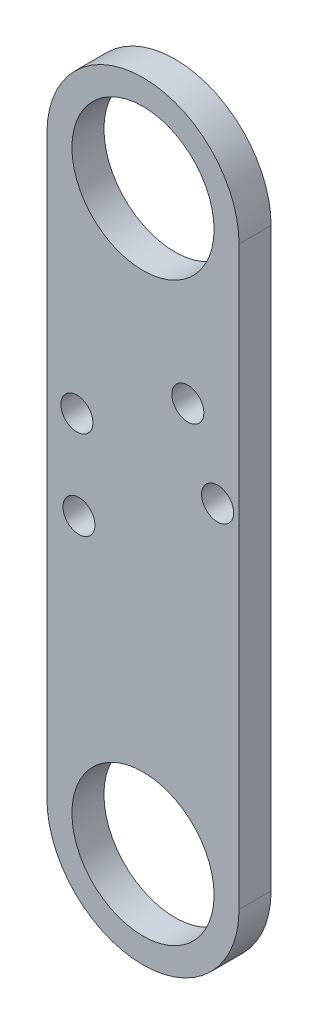
ISO-10303-21;
HEADER;
FILE_DESCRIPTION(('STEP AP214'),'2;1');
FILE_NAME('part.step','',(''),(''),'','','');
FILE_SCHEMA(('AUTOMOTIVE_DESIGN { 1 0 10303 214 1 1 1 1 }'));
ENDSEC;
DATA;
#1=APPLICATION_CONTEXT('core data for automotive mechanical design processes');
#2=APPLICATION_PROTOCOL_DEFINITION('international standard','automotive_design',2000,#1);
#3=PRODUCT_CONTEXT('',#1,'mechanical');
#4=PRODUCT('Part','Part','',(#3));
#5=PRODUCT_RELATED_PRODUCT_CATEGORY('part','',(#4));
#6=PRODUCT_DEFINITION_FORMATION('','',#4);
#7=PRODUCT_DEFINITION_CONTEXT('part definition',#1,'design');
#8=PRODUCT_DEFINITION('design','',#6,#7);
#9=PRODUCT_DEFINITION_SHAPE('','',#8);
#10=(LENGTH_UNIT() NAMED_UNIT(*) SI_UNIT(.MILLI.,.METRE.));
#11=(NAMED_UNIT(*) PLANE_ANGLE_UNIT() SI_UNIT($,.RADIAN.));
#12=(NAMED_UNIT(*) SI_UNIT($,.STERADIAN.) SOLID_ANGLE_UNIT());
#13=UNCERTAINTY_MEASURE_WITH_UNIT(LENGTH_MEASURE(1.E-05),#10,'distance_accuracy_value','');
#14=(GEOMETRIC_REPRESENTATION_CONTEXT(3) GLOBAL_UNCERTAINTY_ASSIGNED_CONTEXT((#13)) GLOBAL_UNIT_ASSIGNED_CONTEXT((#10,
#11,#12)) REPRESENTATION_CONTEXT('',''));
#15=CARTESIAN_POINT('',(0.,0.,0.));
#16=DIRECTION('',(0.,0.,1.));
#17=DIRECTION('',(1.,0.,0.));
#18=AXIS2_PLACEMENT_3D('',#15,#16,#17);
#19=CARTESIAN_POINT('',(0.,0.,72.));
#20=DIRECTION('',(0.,0.,-1.));
#21=DIRECTION('',(-1.,0.,0.));
#22=AXIS2_PLACEMENT_3D('',#19,#20,#21);
#23=CYLINDRICAL_SURFACE('',#22,15.);
#24=CARTESIAN_POINT('',(0.,0.,67.));
#25=DIRECTION('',(0.,0.,-1.));
#26=DIRECTION('',(-1.,0.,0.));
#27=AXIS2_PLACEMENT_3D('',#24,#25,#26);
#28=CIRCLE('',#27,15.);
#29=CARTESIAN_POINT('',(15.,0.,67.));
#30=VERTEX_POINT('',#29);
#31=CARTESIAN_POINT('',(-15.,0.,67.));
#32=VERTEX_POINT('',#31);
#33=EDGE_CURVE('E71',#30,#32,#28,.T.);
#34=ORIENTED_EDGE('',*,*,#33,.F.);
#35=DIRECTION('',(0.,0.,-1.));
#36=VECTOR('',#35,1.);
#37=CARTESIAN_POINT('',(15.,0.,72.));
#38=LINE('',#37,#36);
#39=CARTESIAN_POINT('',(15.,0.,72.));
#40=VERTEX_POINT('',#39);
#41=EDGE_CURVE('E118',#40,#30,#38,.T.);
#42=ORIENTED_EDGE('',*,*,#41,.F.);
#43=CARTESIAN_POINT('',(0.,0.,72.));
#44=DIRECTION('',(0.,0.,1.));
#45=DIRECTION('',(1.,0.,0.));
#46=AXIS2_PLACEMENT_3D('',#43,#44,#45);
#47=CIRCLE('',#46,15.);
#48=CARTESIAN_POINT('',(-15.,0.,72.));
#49=VERTEX_POINT('',#48);
#50=EDGE_CURVE('E148',#49,#40,#47,.T.);
#51=ORIENTED_EDGE('',*,*,#50,.F.);
#52=DIRECTION('',(0.,0.,-1.));
#53=VECTOR('',#52,1.);
#54=CARTESIAN_POINT('',(-15.,0.,72.));
#55=LINE('',#54,#53);
#56=EDGE_CURVE('E125',#49,#32,#55,.T.);
#57=ORIENTED_EDGE('',*,*,#56,.T.);
#58=EDGE_LOOP('',(#34,#42,#51,#57));
#59=FACE_BOUND('',#58,.T.);
#60=ADVANCED_FACE('F62',(#59),#23,.T.);
#61=CARTESIAN_POINT('',(0.,0.,72.));
#62=DIRECTION('',(0.,0.,-1.));
#63=DIRECTION('',(-1.,0.,0.));
#64=AXIS2_PLACEMENT_3D('',#61,#62,#63);
#65=CYLINDRICAL_SURFACE('',#64,11.1);
#66=CARTESIAN_POINT('',(0.,0.,72.));
#67=DIRECTION('',(0.,0.,1.));
#68=DIRECTION('',(1.,0.,0.));
#69=AXIS2_PLACEMENT_3D('',#66,#67,#68);
#70=CIRCLE('',#69,11.1);
#71=CARTESIAN_POINT('',(11.1,0.,72.));
#72=VERTEX_POINT('',#71);
#73=EDGE_CURVE('E132',#72,#72,#70,.T.);
#74=ORIENTED_EDGE('',*,*,#73,.T.);
#75=EDGE_LOOP('',(#74));
#76=FACE_BOUND('',#75,.T.);
#77=CARTESIAN_POINT('',(0.,0.,67.));
#78=DIRECTION('',(0.,0.,-1.));
#79=DIRECTION('',(-1.,0.,0.));
#80=AXIS2_PLACEMENT_3D('',#77,#78,#79);
#81=CIRCLE('',#80,11.1);
#82=CARTESIAN_POINT('',(-11.1,0.,67.));
#83=VERTEX_POINT('',#82);
#84=EDGE_CURVE('E135',#83,#83,#81,.T.);
#85=ORIENTED_EDGE('',*,*,#84,.T.);
#86=EDGE_LOOP('',(#85));
#87=FACE_BOUND('',#86,.T.);
#88=ADVANCED_FACE('F190',(#76,#87),#65,.F.);
#89=CARTESIAN_POINT('',(0.,90.,72.));
#90=DIRECTION('',(0.,0.,-1.));
#91=DIRECTION('',(-1.,0.,0.));
#92=AXIS2_PLACEMENT_3D('',#89,#90,#91);
#93=CYLINDRICAL_SURFACE('',#92,15.);
#94=CARTESIAN_POINT('',(0.,90.,67.));
#95=DIRECTION('',(0.,0.,-1.));
#96=DIRECTION('',(-1.,0.,0.));
#97=AXIS2_PLACEMENT_3D('',#94,#95,#96);
#98=CIRCLE('',#97,15.);
#99=CARTESIAN_POINT('',(-15.,90.,67.));
#100=VERTEX_POINT('',#99);
#101=CARTESIAN_POINT('',(15.,90.,67.));
#102=VERTEX_POINT('',#101);
#103=EDGE_CURVE('E99',#100,#102,#98,.T.);
#104=ORIENTED_EDGE('',*,*,#103,.F.);
#105=DIRECTION('',(0.,0.,-1.));
#106=VECTOR('',#105,1.);
#107=CARTESIAN_POINT('',(-15.,90.,72.));
#108=LINE('',#107,#106);
#109=CARTESIAN_POINT('',(-15.,90.,72.));
#110=VERTEX_POINT('',#109);
#111=EDGE_CURVE('E123',#110,#100,#108,.T.);
#112=ORIENTED_EDGE('',*,*,#111,.F.);
#113=CARTESIAN_POINT('',(0.,90.,72.));
#114=DIRECTION('',(0.,0.,1.));
#115=DIRECTION('',(1.,0.,0.));
#116=AXIS2_PLACEMENT_3D('',#113,#114,#115);
#117=CIRCLE('',#116,15.);
#118=CARTESIAN_POINT('',(15.,90.,72.));
#119=VERTEX_POINT('',#118);
#120=EDGE_CURVE('E122',#119,#110,#117,.T.);
#121=ORIENTED_EDGE('',*,*,#120,.F.);
#122=DIRECTION('',(0.,0.,-1.));
#123=VECTOR('',#122,1.);
#124=CARTESIAN_POINT('',(15.,90.,72.));
#125=LINE('',#124,#123);
#126=EDGE_CURVE('E115',#119,#102,#125,.T.);
#127=ORIENTED_EDGE('',*,*,#126,.T.);
#128=EDGE_LOOP('',(#104,#112,#121,#127));
#129=FACE_BOUND('',#128,.T.);
#130=ADVANCED_FACE('F120',(#129),#93,.T.);
#131=CARTESIAN_POINT('',(0.,90.,72.));
#132=DIRECTION('',(0.,0.,-1.));
#133=DIRECTION('',(-1.,0.,0.));
#134=AXIS2_PLACEMENT_3D('',#131,#132,#133);
#135=CYLINDRICAL_SURFACE('',#134,11.1);
#136=CARTESIAN_POINT('',(0.,90.,72.));
#137=DIRECTION('',(0.,0.,1.));
#138=DIRECTION('',(1.,0.,0.));
#139=AXIS2_PLACEMENT_3D('',#136,#137,#138);
#140=CIRCLE('',#139,11.1);
#141=CARTESIAN_POINT('',(11.1,90.,72.));
#142=VERTEX_POINT('',#141);
#143=EDGE_CURVE('E137',#142,#142,#140,.T.);
#144=ORIENTED_EDGE('',*,*,#143,.T.);
#145=EDGE_LOOP('',(#144));
#146=FACE_BOUND('',#145,.T.);
#147=CARTESIAN_POINT('',(0.,90.,67.));
#148=DIRECTION('',(0.,0.,-1.));
#149=DIRECTION('',(-1.,0.,0.));
#150=AXIS2_PLACEMENT_3D('',#147,#148,#149);
#151=CIRCLE('',#150,11.1);
#152=CARTESIAN_POINT('',(-11.1,90.,67.));
#153=VERTEX_POINT('',#152);
#154=EDGE_CURVE('E142',#153,#153,#151,.T.);
#155=ORIENTED_EDGE('',*,*,#154,.T.);
#156=EDGE_LOOP('',(#155));
#157=FACE_BOUND('',#156,.T.);
#158=ADVANCED_FACE('F64',(#146,#157),#135,.F.);
#159=CARTESIAN_POINT('',(55.,115.,67.));
#160=DIRECTION('',(0.,0.,-1.));
#161=DIRECTION('',(-1.,0.,0.));
#162=AXIS2_PLACEMENT_3D('',#159,#160,#161);
#163=PLANE('',#162);
#164=ORIENTED_EDGE('',*,*,#33,.T.);
#165=DIRECTION('',(0.,-1.,0.));
#166=VECTOR('',#165,1.);
#167=CARTESIAN_POINT('',(-15.,115.,67.));
#168=LINE('',#167,#166);
#169=EDGE_CURVE('E12',#100,#32,#168,.T.);
#170=ORIENTED_EDGE('',*,*,#169,.F.);
#171=ORIENTED_EDGE('',*,*,#103,.T.);
#172=DIRECTION('',(0.,-1.,0.));
#173=VECTOR('',#172,1.);
#174=CARTESIAN_POINT('',(15.,90.,67.));
#175=LINE('',#174,#173);
#176=EDGE_CURVE('E103',#102,#30,#175,.T.);
#177=ORIENTED_EDGE('',*,*,#176,.T.);
#178=EDGE_LOOP('',(#164,#170,#171,#177));
#179=FACE_BOUND('',#178,.T.);
#180=ORIENTED_EDGE('',*,*,#154,.F.);
#181=EDGE_LOOP('',(#180));
#182=FACE_BOUND('',#181,.T.);
#183=CARTESIAN_POINT('',(11.650635094611,53.21224929608,67.));
#184=DIRECTION('',(0.,0.,1.));
#185=DIRECTION('',(1.,0.,0.));
#186=AXIS2_PLACEMENT_3D('',#183,#184,#185);
#187=CIRCLE('',#186,2.5);
#188=CARTESIAN_POINT('',(14.150635094611,53.21224929608,67.));
#189=VERTEX_POINT('',#188);
#190=EDGE_CURVE('E160',#189,#189,#187,.F.);
#191=ORIENTED_EDGE('',*,*,#190,.F.);
#192=EDGE_LOOP('',(#191));
#193=FACE_BOUND('',#192,.T.);
#194=CARTESIAN_POINT('',(-10.,40.71224929608,67.));
#195=DIRECTION('',(0.,0.,1.));
#196=DIRECTION('',(1.,0.,0.));
#197=AXIS2_PLACEMENT_3D('',#194,#195,#196);
#198=CIRCLE('',#197,2.5);
#199=CARTESIAN_POINT('',(-7.50000000000001,40.71224929608,67.));
#200=VERTEX_POINT('',#199);
#201=EDGE_CURVE('E164',#200,#200,#198,.F.);
#202=ORIENTED_EDGE('',*,*,#201,.F.);
#203=EDGE_LOOP('',(#202));
#204=FACE_BOUND('',#203,.T.);
#205=ORIENTED_EDGE('',*,*,#84,.F.);
#206=EDGE_LOOP('',(#205));
#207=FACE_BOUND('',#206,.T.);
#208=CARTESIAN_POINT('',(7.,64.4114817289327,67.));
#209=DIRECTION('',(0.,0.,1.));
#210=DIRECTION('',(1.,0.,0.));
#211=AXIS2_PLACEMENT_3D('',#208,#209,#210);
#212=CIRCLE('',#211,2.5);
#213=CARTESIAN_POINT('',(9.5,64.4114817289327,67.));
#214=VERTEX_POINT('',#213);
#215=EDGE_CURVE('E66',#214,#214,#212,.F.);
#216=ORIENTED_EDGE('',*,*,#215,.F.);
#217=EDGE_LOOP('',(#216));
#218=FACE_BOUND('',#217,.T.);
#219=CARTESIAN_POINT('',(-10.3205080756888,54.4114817289327,67.));
#220=DIRECTION('',(0.,0.,1.));
#221=DIRECTION('',(1.,0.,0.));
#222=AXIS2_PLACEMENT_3D('',#219,#220,#221);
#223=CIRCLE('',#222,2.5);
#224=CARTESIAN_POINT('',(-7.82050807568877,54.4114817289327,67.));
#225=VERTEX_POINT('',#224);
#226=EDGE_CURVE('E167',#225,#225,#223,.F.);
#227=ORIENTED_EDGE('',*,*,#226,.F.);
#228=EDGE_LOOP('',(#227));
#229=FACE_BOUND('',#228,.T.);
#230=ADVANCED_FACE('F101',(#179,#182,#193,#204,#207,#218,#229),#163,.T.);
#231=CARTESIAN_POINT('',(15.,90.,72.));
#232=DIRECTION('',(-1.,0.,0.));
#233=DIRECTION('',(0.,-1.,0.));
#234=AXIS2_PLACEMENT_3D('',#231,#232,#233);
#235=PLANE('',#234);
#236=ORIENTED_EDGE('',*,*,#176,.F.);
#237=ORIENTED_EDGE('',*,*,#126,.F.);
#238=DIRECTION('',(0.,1.,0.));
#239=VECTOR('',#238,1.);
#240=CARTESIAN_POINT('',(15.,90.,72.));
#241=LINE('',#240,#239);
#242=EDGE_CURVE('E108',#40,#119,#241,.T.);
#243=ORIENTED_EDGE('',*,*,#242,.F.);
#244=ORIENTED_EDGE('',*,*,#41,.T.);
#245=EDGE_LOOP('',(#236,#237,#243,#244));
#246=FACE_BOUND('',#245,.T.);
#247=ADVANCED_FACE('F113',(#246),#235,.F.);
#248=CARTESIAN_POINT('',(-15.,90.,72.));
#249=DIRECTION('',(1.,0.,0.));
#250=DIRECTION('',(0.,1.,0.));
#251=AXIS2_PLACEMENT_3D('',#248,#249,#250);
#252=PLANE('',#251);
#253=ORIENTED_EDGE('',*,*,#111,.T.);
#254=ORIENTED_EDGE('',*,*,#169,.T.);
#255=ORIENTED_EDGE('',*,*,#56,.F.);
#256=DIRECTION('',(0.,-1.,0.));
#257=VECTOR('',#256,1.);
#258=CARTESIAN_POINT('',(-15.,90.,72.));
#259=LINE('',#258,#257);
#260=EDGE_CURVE('E146',#110,#49,#259,.T.);
#261=ORIENTED_EDGE('',*,*,#260,.F.);
#262=EDGE_LOOP('',(#253,#254,#255,#261));
#263=FACE_BOUND('',#262,.T.);
#264=ADVANCED_FACE('F184',(#263),#252,.F.);
#265=CARTESIAN_POINT('',(11.650635094611,53.21224929608,72.));
#266=DIRECTION('',(0.,0.,-1.));
#267=DIRECTION('',(0.,1.,0.));
#268=AXIS2_PLACEMENT_3D('',#265,#266,#267);
#269=CYLINDRICAL_SURFACE('',#268,2.5);
#270=ORIENTED_EDGE('',*,*,#190,.T.);
#271=EDGE_LOOP('',(#270));
#272=FACE_BOUND('',#271,.T.);
#273=CARTESIAN_POINT('',(11.650635094611,53.21224929608,72.));
#274=DIRECTION('',(0.,0.,-1.));
#275=DIRECTION('',(0.,1.,0.));
#276=AXIS2_PLACEMENT_3D('',#273,#274,#275);
#277=CIRCLE('',#276,2.5);
#278=CARTESIAN_POINT('',(11.650635094611,55.71224929608,72.));
#279=VERTEX_POINT('',#278);
#280=EDGE_CURVE('E128',#279,#279,#277,.T.);
#281=ORIENTED_EDGE('',*,*,#280,.F.);
#282=EDGE_LOOP('',(#281));
#283=FACE_BOUND('',#282,.T.);
#284=ADVANCED_FACE('F199',(#272,#283),#269,.F.);
#285=CARTESIAN_POINT('',(-10.,40.71224929608,72.));
#286=DIRECTION('',(0.,0.,-1.));
#287=DIRECTION('',(0.,1.,0.));
#288=AXIS2_PLACEMENT_3D('',#285,#286,#287);
#289=CYLINDRICAL_SURFACE('',#288,2.5);
#290=ORIENTED_EDGE('',*,*,#201,.T.);
#291=EDGE_LOOP('',(#290));
#292=FACE_BOUND('',#291,.T.);
#293=CARTESIAN_POINT('',(-10.,40.71224929608,72.));
#294=DIRECTION('',(0.,0.,-1.));
#295=DIRECTION('',(0.,1.,0.));
#296=AXIS2_PLACEMENT_3D('',#293,#294,#295);
#297=CIRCLE('',#296,2.5);
#298=CARTESIAN_POINT('',(-10.,43.2122492960801,72.));
#299=VERTEX_POINT('',#298);
#300=EDGE_CURVE('E153',#299,#299,#297,.T.);
#301=ORIENTED_EDGE('',*,*,#300,.F.);
#302=EDGE_LOOP('',(#301));
#303=FACE_BOUND('',#302,.T.);
#304=ADVANCED_FACE('F253',(#292,#303),#289,.F.);
#305=CARTESIAN_POINT('',(-10.3205080756888,54.4114817289327,72.));
#306=DIRECTION('',(0.,0.,-1.));
#307=DIRECTION('',(0.,1.,0.));
#308=AXIS2_PLACEMENT_3D('',#305,#306,#307);
#309=CYLINDRICAL_SURFACE('',#308,2.5);
#310=ORIENTED_EDGE('',*,*,#226,.T.);
#311=EDGE_LOOP('',(#310));
#312=FACE_BOUND('',#311,.T.);
#313=CARTESIAN_POINT('',(-10.3205080756888,54.4114817289327,72.));
#314=DIRECTION('',(0.,0.,-1.));
#315=DIRECTION('',(0.,1.,0.));
#316=AXIS2_PLACEMENT_3D('',#313,#314,#315);
#317=CIRCLE('',#316,2.5);
#318=CARTESIAN_POINT('',(-10.3205080756888,56.9114817289327,72.));
#319=VERTEX_POINT('',#318);
#320=EDGE_CURVE('E156',#319,#319,#317,.T.);
#321=ORIENTED_EDGE('',*,*,#320,.F.);
#322=EDGE_LOOP('',(#321));
#323=FACE_BOUND('',#322,.T.);
#324=ADVANCED_FACE('F220',(#312,#323),#309,.F.);
#325=CARTESIAN_POINT('',(0.,90.,72.));
#326=DIRECTION('',(0.,0.,1.));
#327=DIRECTION('',(1.,0.,0.));
#328=AXIS2_PLACEMENT_3D('',#325,#326,#327);
#329=PLANE('',#328);
#330=CARTESIAN_POINT('',(7.,64.4114817289327,72.));
#331=DIRECTION('',(0.,0.,-1.));
#332=DIRECTION('',(0.,1.,0.));
#333=AXIS2_PLACEMENT_3D('',#330,#331,#332);
#334=CIRCLE('',#333,2.5);
#335=CARTESIAN_POINT('',(7.,66.9114817289327,72.));
#336=VERTEX_POINT('',#335);
#337=EDGE_CURVE('E124',#336,#336,#334,.T.);
#338=ORIENTED_EDGE('',*,*,#337,.T.);
#339=EDGE_LOOP('',(#338));
#340=FACE_BOUND('',#339,.T.);
#341=ORIENTED_EDGE('',*,*,#320,.T.);
#342=EDGE_LOOP('',(#341));
#343=FACE_BOUND('',#342,.T.);
#344=ORIENTED_EDGE('',*,*,#300,.T.);
#345=EDGE_LOOP('',(#344));
#346=FACE_BOUND('',#345,.T.);
#347=ORIENTED_EDGE('',*,*,#280,.T.);
#348=EDGE_LOOP('',(#347));
#349=FACE_BOUND('',#348,.T.);
#350=ORIENTED_EDGE('',*,*,#73,.F.);
#351=EDGE_LOOP('',(#350));
#352=FACE_BOUND('',#351,.T.);
#353=ORIENTED_EDGE('',*,*,#120,.T.);
#354=ORIENTED_EDGE('',*,*,#260,.T.);
#355=ORIENTED_EDGE('',*,*,#50,.T.);
#356=ORIENTED_EDGE('',*,*,#242,.T.);
#357=EDGE_LOOP('',(#353,#354,#355,#356));
#358=FACE_BOUND('',#357,.T.);
#359=ORIENTED_EDGE('',*,*,#143,.F.);
#360=EDGE_LOOP('',(#359));
#361=FACE_BOUND('',#360,.T.);
#362=ADVANCED_FACE('F217',(#340,#343,#346,#349,#352,#358,#361),#329,.T.);
#363=CARTESIAN_POINT('',(7.,64.4114817289327,72.));
#364=DIRECTION('',(0.,0.,-1.));
#365=DIRECTION('',(0.,1.,0.));
#366=AXIS2_PLACEMENT_3D('',#363,#364,#365);
#367=CYLINDRICAL_SURFACE('',#366,2.5);
#368=ORIENTED_EDGE('',*,*,#215,.T.);
#369=EDGE_LOOP('',(#368));
#370=FACE_BOUND('',#369,.T.);
#371=ORIENTED_EDGE('',*,*,#337,.F.);
#372=EDGE_LOOP('',(#371));
#373=FACE_BOUND('',#372,.T.);
#374=ADVANCED_FACE('F174',(#370,#373),#367,.F.);
#375=CLOSED_SHELL('',(#60,#88,#130,#158,#230,#247,#264,#284,#304,#324,#362,#374));
#376=MANIFOLD_SOLID_BREP('B2',#375);
#377=ADVANCED_BREP_SHAPE_REPRESENTATION('',(#18,#376),#14);
#378=SHAPE_DEFINITION_REPRESENTATION(#9,#377);
ENDSEC;
END-ISO-10303-21;
